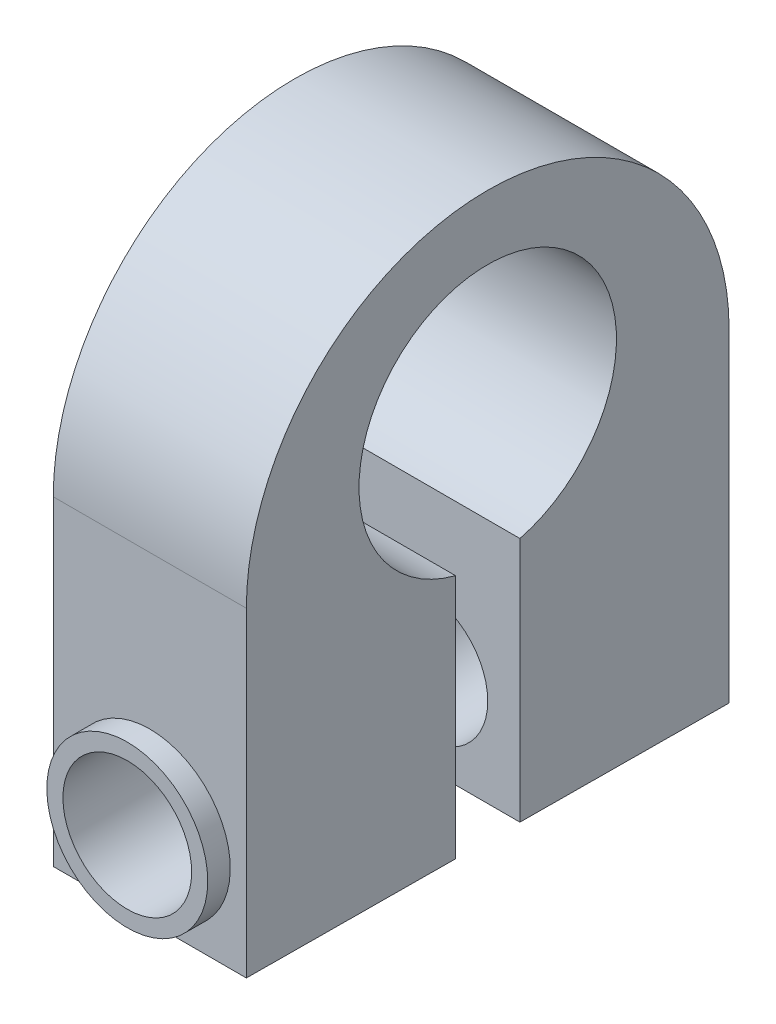
ISO-10303-21;
HEADER;
FILE_DESCRIPTION(('STEP AP214'),'2;1');
FILE_NAME('part.step','',(''),(''),'','','');
FILE_SCHEMA(('AUTOMOTIVE_DESIGN { 1 0 10303 214 1 1 1 1 }'));
ENDSEC;
DATA;
#1=APPLICATION_CONTEXT('core data for automotive mechanical design processes');
#2=APPLICATION_PROTOCOL_DEFINITION('international standard','automotive_design',2000,#1);
#3=PRODUCT_CONTEXT('',#1,'mechanical');
#4=PRODUCT('Part','Part','',(#3));
#5=PRODUCT_RELATED_PRODUCT_CATEGORY('part','',(#4));
#6=PRODUCT_DEFINITION_FORMATION('','',#4);
#7=PRODUCT_DEFINITION_CONTEXT('part definition',#1,'design');
#8=PRODUCT_DEFINITION('design','',#6,#7);
#9=PRODUCT_DEFINITION_SHAPE('','',#8);
#10=(LENGTH_UNIT() NAMED_UNIT(*) SI_UNIT(.MILLI.,.METRE.));
#11=(NAMED_UNIT(*) PLANE_ANGLE_UNIT() SI_UNIT($,.RADIAN.));
#12=(NAMED_UNIT(*) SI_UNIT($,.STERADIAN.) SOLID_ANGLE_UNIT());
#13=UNCERTAINTY_MEASURE_WITH_UNIT(LENGTH_MEASURE(1.E-05),#10,'distance_accuracy_value','');
#14=(GEOMETRIC_REPRESENTATION_CONTEXT(3) GLOBAL_UNCERTAINTY_ASSIGNED_CONTEXT((#13)) GLOBAL_UNIT_ASSIGNED_CONTEXT((#10,
#11,#12)) REPRESENTATION_CONTEXT('',''));
#15=CARTESIAN_POINT('',(0.,0.,0.));
#16=DIRECTION('',(0.,0.,1.));
#17=DIRECTION('',(1.,0.,0.));
#18=AXIS2_PLACEMENT_3D('',#15,#16,#17);
#19=CARTESIAN_POINT('',(0.,0.,81.0000000000001));
#20=DIRECTION('',(0.,0.,-1.));
#21=DIRECTION('',(-1.,0.,0.));
#22=AXIS2_PLACEMENT_3D('',#19,#20,#21);
#23=CYLINDRICAL_SURFACE('',#22,10.);
#24=CARTESIAN_POINT('',(0.,0.,0.));
#25=DIRECTION('',(0.,0.,1.));
#26=DIRECTION('',(1.,0.,0.));
#27=AXIS2_PLACEMENT_3D('',#24,#25,#26);
#28=CIRCLE('',#27,10.);
#29=CARTESIAN_POINT('',(10.,0.,0.));
#30=VERTEX_POINT('',#29);
#31=EDGE_CURVE('E156',#30,#30,#28,.T.);
#32=ORIENTED_EDGE('',*,*,#31,.F.);
#33=EDGE_LOOP('',(#32));
#34=FACE_BOUND('',#33,.T.);
#35=CARTESIAN_POINT('',(0.,0.,35.));
#36=DIRECTION('',(0.,0.,1.));
#37=DIRECTION('',(1.,0.,0.));
#38=AXIS2_PLACEMENT_3D('',#35,#36,#37);
#39=CIRCLE('',#38,10.);
#40=CARTESIAN_POINT('',(10.,0.,35.));
#41=VERTEX_POINT('',#40);
#42=EDGE_CURVE('E37',#41,#41,#39,.T.);
#43=ORIENTED_EDGE('',*,*,#42,.T.);
#44=EDGE_LOOP('',(#43));
#45=FACE_BOUND('',#44,.T.);
#46=ADVANCED_FACE('F33',(#34,#45),#23,.F.);
#47=CARTESIAN_POINT('',(0.,0.,81.0000000000001));
#48=DIRECTION('',(0.,0.,1.));
#49=DIRECTION('',(1.,0.,0.));
#50=AXIS2_PLACEMENT_3D('',#47,#48,#49);
#51=CIRCLE('',#50,10.);
#52=CARTESIAN_POINT('',(10.,0.,81.0000000000001));
#53=VERTEX_POINT('',#52);
#54=EDGE_CURVE('E153',#53,#53,#51,.T.);
#55=ORIENTED_EDGE('',*,*,#54,.T.);
#56=EDGE_LOOP('',(#55));
#57=FACE_BOUND('',#56,.T.);
#58=CARTESIAN_POINT('',(0.,0.,45.));
#59=DIRECTION('',(0.,0.,-1.));
#60=DIRECTION('',(-1.,0.,0.));
#61=AXIS2_PLACEMENT_3D('',#58,#59,#60);
#62=CIRCLE('',#61,10.);
#63=CARTESIAN_POINT('',(-10.,0.,45.));
#64=VERTEX_POINT('',#63);
#65=EDGE_CURVE('E222',#64,#64,#62,.T.);
#66=ORIENTED_EDGE('',*,*,#65,.T.);
#67=EDGE_LOOP('',(#66));
#68=FACE_BOUND('',#67,.T.);
#69=ADVANCED_FACE('F162',(#57,#68),#23,.F.);
#70=CARTESIAN_POINT('',(15.,0.,35.));
#71=DIRECTION('',(0.,0.,-1.));
#72=DIRECTION('',(-1.,0.,0.));
#73=AXIS2_PLACEMENT_3D('',#70,#71,#72);
#74=PLANE('',#73);
#75=DIRECTION('',(0.,-1.,0.));
#76=VECTOR('',#75,1.);
#77=CARTESIAN_POINT('',(-15.,0.,35.));
#78=LINE('',#77,#76);
#79=CARTESIAN_POINT('',(-15.,24.3850832689629,35.));
#80=VERTEX_POINT('',#79);
#81=CARTESIAN_POINT('',(-15.,-13.7833333333333,35.));
#82=VERTEX_POINT('',#81);
#83=EDGE_CURVE('E218',#80,#82,#78,.T.);
#84=ORIENTED_EDGE('',*,*,#83,.T.);
#85=DIRECTION('',(-1.,0.,0.));
#86=VECTOR('',#85,1.);
#87=CARTESIAN_POINT('',(15.,-13.7833333333333,35.));
#88=LINE('',#87,#86);
#89=CARTESIAN_POINT('',(15.,-13.7833333333333,35.));
#90=VERTEX_POINT('',#89);
#91=EDGE_CURVE('E227',#90,#82,#88,.T.);
#92=ORIENTED_EDGE('',*,*,#91,.F.);
#93=DIRECTION('',(0.,-1.,0.));
#94=VECTOR('',#93,1.);
#95=CARTESIAN_POINT('',(15.,0.,35.));
#96=LINE('',#95,#94);
#97=CARTESIAN_POINT('',(15.,24.3850832689629,35.));
#98=VERTEX_POINT('',#97);
#99=EDGE_CURVE('E136',#98,#90,#96,.T.);
#100=ORIENTED_EDGE('',*,*,#99,.F.);
#101=DIRECTION('',(-1.,0.,0.));
#102=VECTOR('',#101,1.);
#103=CARTESIAN_POINT('',(15.,24.3850832689629,35.));
#104=LINE('',#103,#102);
#105=EDGE_CURVE('E43',#98,#80,#104,.T.);
#106=ORIENTED_EDGE('',*,*,#105,.T.);
#107=EDGE_LOOP('',(#84,#92,#100,#106));
#108=FACE_BOUND('',#107,.T.);
#109=ORIENTED_EDGE('',*,*,#42,.F.);
#110=EDGE_LOOP('',(#109));
#111=FACE_BOUND('',#110,.T.);
#112=ADVANCED_FACE('F187',(#108,#111),#74,.F.);
#113=CARTESIAN_POINT('',(15.,0.,2.5));
#114=DIRECTION('',(0.,0.,-1.));
#115=DIRECTION('',(0.,1.,0.));
#116=AXIS2_PLACEMENT_3D('',#113,#114,#115);
#117=PLANE('',#116);
#118=DIRECTION('',(0.,-1.,0.));
#119=VECTOR('',#118,1.);
#120=CARTESIAN_POINT('',(-15.,0.,2.5));
#121=LINE('',#120,#119);
#122=CARTESIAN_POINT('',(-15.,36.25,2.5));
#123=VERTEX_POINT('',#122);
#124=CARTESIAN_POINT('',(-15.,-14.,2.5));
#125=VERTEX_POINT('',#124);
#126=EDGE_CURVE('E241',#123,#125,#121,.T.);
#127=ORIENTED_EDGE('',*,*,#126,.F.);
#128=DIRECTION('',(-1.,0.,0.));
#129=VECTOR('',#128,1.);
#130=CARTESIAN_POINT('',(15.,36.25,2.5));
#131=LINE('',#130,#129);
#132=CARTESIAN_POINT('',(15.,36.25,2.5));
#133=VERTEX_POINT('',#132);
#134=EDGE_CURVE('E231',#133,#123,#131,.T.);
#135=ORIENTED_EDGE('',*,*,#134,.F.);
#136=DIRECTION('',(0.,-1.,0.));
#137=VECTOR('',#136,1.);
#138=CARTESIAN_POINT('',(15.,0.,2.5));
#139=LINE('',#138,#137);
#140=CARTESIAN_POINT('',(15.,-14.,2.5));
#141=VERTEX_POINT('',#140);
#142=EDGE_CURVE('E135',#133,#141,#139,.T.);
#143=ORIENTED_EDGE('',*,*,#142,.T.);
#144=DIRECTION('',(-1.,0.,0.));
#145=VECTOR('',#144,1.);
#146=CARTESIAN_POINT('',(15.,-14.,2.5));
#147=LINE('',#146,#145);
#148=EDGE_CURVE('E229',#141,#125,#147,.T.);
#149=ORIENTED_EDGE('',*,*,#148,.T.);
#150=EDGE_LOOP('',(#127,#135,#143,#149));
#151=FACE_BOUND('',#150,.T.);
#152=CARTESIAN_POINT('',(0.,0.,2.5));
#153=DIRECTION('',(0.,0.,-1.));
#154=DIRECTION('',(0.,1.,0.));
#155=AXIS2_PLACEMENT_3D('',#152,#153,#154);
#156=CIRCLE('',#155,12.5);
#157=CARTESIAN_POINT('',(0.,12.5,2.5));
#158=VERTEX_POINT('',#157);
#159=EDGE_CURVE('E145',#158,#158,#156,.F.);
#160=ORIENTED_EDGE('',*,*,#159,.T.);
#161=EDGE_LOOP('',(#160));
#162=FACE_BOUND('',#161,.T.);
#163=ADVANCED_FACE('F205',(#151,#162),#117,.T.);
#164=CARTESIAN_POINT('',(15.,0.,77.5));
#165=DIRECTION('',(0.,0.,-1.));
#166=DIRECTION('',(0.,1.,0.));
#167=AXIS2_PLACEMENT_3D('',#164,#165,#166);
#168=PLANE('',#167);
#169=DIRECTION('',(0.,-1.,0.));
#170=VECTOR('',#169,1.);
#171=CARTESIAN_POINT('',(-15.,0.,77.5));
#172=LINE('',#171,#170);
#173=CARTESIAN_POINT('',(-15.,36.25,77.5));
#174=VERTEX_POINT('',#173);
#175=CARTESIAN_POINT('',(-15.,-13.5,77.5));
#176=VERTEX_POINT('',#175);
#177=EDGE_CURVE('E122',#174,#176,#172,.T.);
#178=ORIENTED_EDGE('',*,*,#177,.T.);
#179=DIRECTION('',(-1.,0.,0.));
#180=VECTOR('',#179,1.);
#181=CARTESIAN_POINT('',(15.,-13.5,77.5));
#182=LINE('',#181,#180);
#183=CARTESIAN_POINT('',(15.,-13.5,77.5));
#184=VERTEX_POINT('',#183);
#185=EDGE_CURVE('E118',#184,#176,#182,.T.);
#186=ORIENTED_EDGE('',*,*,#185,.F.);
#187=DIRECTION('',(0.,-1.,0.));
#188=VECTOR('',#187,1.);
#189=CARTESIAN_POINT('',(15.,0.,77.5));
#190=LINE('',#189,#188);
#191=CARTESIAN_POINT('',(15.,36.25,77.5));
#192=VERTEX_POINT('',#191);
#193=EDGE_CURVE('E105',#192,#184,#190,.T.);
#194=ORIENTED_EDGE('',*,*,#193,.F.);
#195=DIRECTION('',(-1.,0.,0.));
#196=VECTOR('',#195,1.);
#197=CARTESIAN_POINT('',(15.,36.25,77.5));
#198=LINE('',#197,#196);
#199=EDGE_CURVE('E126',#192,#174,#198,.T.);
#200=ORIENTED_EDGE('',*,*,#199,.T.);
#201=EDGE_LOOP('',(#178,#186,#194,#200));
#202=FACE_BOUND('',#201,.T.);
#203=CARTESIAN_POINT('',(0.,0.,77.5));
#204=DIRECTION('',(0.,0.,-1.));
#205=DIRECTION('',(0.,1.,0.));
#206=AXIS2_PLACEMENT_3D('',#203,#204,#205);
#207=CIRCLE('',#206,12.5);
#208=CARTESIAN_POINT('',(0.,12.5,77.5));
#209=VERTEX_POINT('',#208);
#210=EDGE_CURVE('E11',#209,#209,#207,.F.);
#211=ORIENTED_EDGE('',*,*,#210,.F.);
#212=EDGE_LOOP('',(#211));
#213=FACE_BOUND('',#212,.T.);
#214=ADVANCED_FACE('F119',(#202,#213),#168,.F.);
#215=CARTESIAN_POINT('',(15.,0.,45.));
#216=DIRECTION('',(0.,0.,1.));
#217=DIRECTION('',(1.,0.,0.));
#218=AXIS2_PLACEMENT_3D('',#215,#216,#217);
#219=PLANE('',#218);
#220=DIRECTION('',(0.,1.,0.));
#221=VECTOR('',#220,1.);
#222=CARTESIAN_POINT('',(-15.,0.,45.));
#223=LINE('',#222,#221);
#224=CARTESIAN_POINT('',(-15.,-13.7166666666667,45.));
#225=VERTEX_POINT('',#224);
#226=CARTESIAN_POINT('',(-15.,24.3850832689629,45.));
#227=VERTEX_POINT('',#226);
#228=EDGE_CURVE('E142',#225,#227,#223,.T.);
#229=ORIENTED_EDGE('',*,*,#228,.T.);
#230=DIRECTION('',(-1.,0.,0.));
#231=VECTOR('',#230,1.);
#232=CARTESIAN_POINT('',(15.,24.3850832689629,45.));
#233=LINE('',#232,#231);
#234=CARTESIAN_POINT('',(15.,24.3850832689629,45.));
#235=VERTEX_POINT('',#234);
#236=EDGE_CURVE('E87',#235,#227,#233,.T.);
#237=ORIENTED_EDGE('',*,*,#236,.F.);
#238=DIRECTION('',(0.,1.,0.));
#239=VECTOR('',#238,1.);
#240=CARTESIAN_POINT('',(15.,0.,45.));
#241=LINE('',#240,#239);
#242=CARTESIAN_POINT('',(15.,-13.7166666666667,45.));
#243=VERTEX_POINT('',#242);
#244=EDGE_CURVE('E52',#243,#235,#241,.T.);
#245=ORIENTED_EDGE('',*,*,#244,.F.);
#246=DIRECTION('',(-1.,0.,0.));
#247=VECTOR('',#246,1.);
#248=CARTESIAN_POINT('',(15.,-13.7166666666667,45.));
#249=LINE('',#248,#247);
#250=EDGE_CURVE('E80',#243,#225,#249,.T.);
#251=ORIENTED_EDGE('',*,*,#250,.T.);
#252=EDGE_LOOP('',(#229,#237,#245,#251));
#253=FACE_BOUND('',#252,.T.);
#254=ORIENTED_EDGE('',*,*,#65,.F.);
#255=EDGE_LOOP('',(#254));
#256=FACE_BOUND('',#255,.T.);
#257=ADVANCED_FACE('F196',(#253,#256),#219,.F.);
#258=CARTESIAN_POINT('',(15.,43.75,40.));
#259=DIRECTION('',(-1.,0.,0.));
#260=DIRECTION('',(0.,0.,1.));
#261=AXIS2_PLACEMENT_3D('',#258,#259,#260);
#262=CYLINDRICAL_SURFACE('',#261,20.);
#263=CARTESIAN_POINT('',(-15.,43.75,40.));
#264=DIRECTION('',(1.,0.,0.));
#265=DIRECTION('',(0.,0.,-1.));
#266=AXIS2_PLACEMENT_3D('',#263,#264,#265);
#267=CIRCLE('',#266,20.);
#268=EDGE_CURVE('E147',#80,#227,#267,.T.);
#269=ORIENTED_EDGE('',*,*,#268,.F.);
#270=ORIENTED_EDGE('',*,*,#105,.F.);
#271=CARTESIAN_POINT('',(15.,43.75,40.));
#272=DIRECTION('',(1.,0.,0.));
#273=DIRECTION('',(0.,0.,-1.));
#274=AXIS2_PLACEMENT_3D('',#271,#272,#273);
#275=CIRCLE('',#274,20.);
#276=EDGE_CURVE('E140',#98,#235,#275,.T.);
#277=ORIENTED_EDGE('',*,*,#276,.T.);
#278=ORIENTED_EDGE('',*,*,#236,.T.);
#279=EDGE_LOOP('',(#269,#270,#277,#278));
#280=FACE_BOUND('',#279,.T.);
#281=ADVANCED_FACE('F35',(#280),#262,.F.);
#282=CARTESIAN_POINT('',(15.,-14.0160437313897,0.0934402915425982));
#283=DIRECTION('',(0.,-0.999977778518491,0.00666651852345661));
#284=DIRECTION('',(0.,-0.00666651852345661,-0.999977778518491));
#285=AXIS2_PLACEMENT_3D('',#282,#283,#284);
#286=PLANE('',#285);
#287=DIRECTION('',(0.,0.00666651852345661,0.999977778518491));
#288=VECTOR('',#287,1.);
#289=CARTESIAN_POINT('',(-15.,-14.0160437313897,0.0934402915425982));
#290=LINE('',#289,#288);
#291=EDGE_CURVE('E244',#125,#82,#290,.T.);
#292=ORIENTED_EDGE('',*,*,#291,.F.);
#293=ORIENTED_EDGE('',*,*,#148,.F.);
#294=DIRECTION('',(0.,0.00666651852345661,0.999977778518491));
#295=VECTOR('',#294,1.);
#296=CARTESIAN_POINT('',(15.,-14.0160437313897,0.0934402915425982));
#297=LINE('',#296,#295);
#298=EDGE_CURVE('E130',#141,#90,#297,.T.);
#299=ORIENTED_EDGE('',*,*,#298,.T.);
#300=ORIENTED_EDGE('',*,*,#91,.T.);
#301=EDGE_LOOP('',(#292,#293,#299,#300));
#302=FACE_BOUND('',#301,.T.);
#303=ADVANCED_FACE('F202',(#302),#286,.T.);
#304=CARTESIAN_POINT('',(15.,36.25,40.));
#305=DIRECTION('',(-1.,0.,0.));
#306=DIRECTION('',(0.,0.,1.));
#307=AXIS2_PLACEMENT_3D('',#304,#305,#306);
#308=CYLINDRICAL_SURFACE('',#307,37.5);
#309=CARTESIAN_POINT('',(-15.,36.25,40.));
#310=DIRECTION('',(1.,0.,0.));
#311=DIRECTION('',(0.,0.,-1.));
#312=AXIS2_PLACEMENT_3D('',#309,#310,#311);
#313=CIRCLE('',#312,37.5);
#314=EDGE_CURVE('E239',#123,#174,#313,.T.);
#315=ORIENTED_EDGE('',*,*,#314,.T.);
#316=ORIENTED_EDGE('',*,*,#199,.F.);
#317=CARTESIAN_POINT('',(15.,36.25,40.));
#318=DIRECTION('',(1.,0.,0.));
#319=DIRECTION('',(0.,0.,-1.));
#320=AXIS2_PLACEMENT_3D('',#317,#318,#319);
#321=CIRCLE('',#320,37.5);
#322=EDGE_CURVE('E112',#133,#192,#321,.T.);
#323=ORIENTED_EDGE('',*,*,#322,.F.);
#324=ORIENTED_EDGE('',*,*,#134,.T.);
#325=EDGE_LOOP('',(#315,#316,#323,#324));
#326=FACE_BOUND('',#325,.T.);
#327=ADVANCED_FACE('F201',(#326),#308,.T.);
#328=EDGE_CURVE('E237',#225,#176,#290,.T.);
#329=ORIENTED_EDGE('',*,*,#328,.F.);
#330=ORIENTED_EDGE('',*,*,#250,.F.);
#331=EDGE_CURVE('E109',#243,#184,#297,.T.);
#332=ORIENTED_EDGE('',*,*,#331,.T.);
#333=ORIENTED_EDGE('',*,*,#185,.T.);
#334=EDGE_LOOP('',(#329,#330,#332,#333));
#335=FACE_BOUND('',#334,.T.);
#336=ADVANCED_FACE('F128',(#335),#286,.T.);
#337=CARTESIAN_POINT('',(15.,0.,0.));
#338=DIRECTION('',(1.,0.,0.));
#339=DIRECTION('',(0.,0.,-1.));
#340=AXIS2_PLACEMENT_3D('',#337,#338,#339);
#341=PLANE('',#340);
#342=ORIENTED_EDGE('',*,*,#276,.F.);
#343=ORIENTED_EDGE('',*,*,#99,.T.);
#344=ORIENTED_EDGE('',*,*,#298,.F.);
#345=ORIENTED_EDGE('',*,*,#142,.F.);
#346=ORIENTED_EDGE('',*,*,#322,.T.);
#347=ORIENTED_EDGE('',*,*,#193,.T.);
#348=ORIENTED_EDGE('',*,*,#331,.F.);
#349=ORIENTED_EDGE('',*,*,#244,.T.);
#350=EDGE_LOOP('',(#342,#343,#344,#345,#346,#347,#348,#349));
#351=FACE_BOUND('',#350,.T.);
#352=ADVANCED_FACE('F107',(#351),#341,.T.);
#353=CARTESIAN_POINT('',(-15.,0.,0.));
#354=DIRECTION('',(1.,0.,0.));
#355=DIRECTION('',(0.,0.,-1.));
#356=AXIS2_PLACEMENT_3D('',#353,#354,#355);
#357=PLANE('',#356);
#358=ORIENTED_EDGE('',*,*,#268,.T.);
#359=ORIENTED_EDGE('',*,*,#228,.F.);
#360=ORIENTED_EDGE('',*,*,#328,.T.);
#361=ORIENTED_EDGE('',*,*,#177,.F.);
#362=ORIENTED_EDGE('',*,*,#314,.F.);
#363=ORIENTED_EDGE('',*,*,#126,.T.);
#364=ORIENTED_EDGE('',*,*,#291,.T.);
#365=ORIENTED_EDGE('',*,*,#83,.F.);
#366=EDGE_LOOP('',(#358,#359,#360,#361,#362,#363,#364,#365));
#367=FACE_BOUND('',#366,.T.);
#368=ADVANCED_FACE('F178',(#367),#357,.F.);
#369=CARTESIAN_POINT('',(0.,0.,81.0000000000001));
#370=DIRECTION('',(0.,0.,-1.));
#371=DIRECTION('',(-1.,0.,0.));
#372=AXIS2_PLACEMENT_3D('',#369,#370,#371);
#373=CYLINDRICAL_SURFACE('',#372,12.5);
#374=CARTESIAN_POINT('',(0.,0.,81.0000000000001));
#375=DIRECTION('',(0.,0.,1.));
#376=DIRECTION('',(1.,0.,0.));
#377=AXIS2_PLACEMENT_3D('',#374,#375,#376);
#378=CIRCLE('',#377,12.5);
#379=CARTESIAN_POINT('',(12.5,0.,81.0000000000001));
#380=VERTEX_POINT('',#379);
#381=EDGE_CURVE('E148',#380,#380,#378,.T.);
#382=ORIENTED_EDGE('',*,*,#381,.F.);
#383=EDGE_LOOP('',(#382));
#384=FACE_BOUND('',#383,.T.);
#385=ORIENTED_EDGE('',*,*,#210,.T.);
#386=EDGE_LOOP('',(#385));
#387=FACE_BOUND('',#386,.T.);
#388=ADVANCED_FACE('F168',(#384,#387),#373,.T.);
#389=CARTESIAN_POINT('',(0.,0.,81.0000000000001));
#390=DIRECTION('',(0.,0.,1.));
#391=DIRECTION('',(1.,0.,0.));
#392=AXIS2_PLACEMENT_3D('',#389,#390,#391);
#393=PLANE('',#392);
#394=ORIENTED_EDGE('',*,*,#381,.T.);
#395=EDGE_LOOP('',(#394));
#396=FACE_BOUND('',#395,.T.);
#397=ORIENTED_EDGE('',*,*,#54,.F.);
#398=EDGE_LOOP('',(#397));
#399=FACE_BOUND('',#398,.T.);
#400=ADVANCED_FACE('F165',(#396,#399),#393,.T.);
#401=ORIENTED_EDGE('',*,*,#159,.F.);
#402=EDGE_LOOP('',(#401));
#403=FACE_BOUND('',#402,.T.);
#404=CARTESIAN_POINT('',(0.,0.,0.));
#405=DIRECTION('',(0.,0.,1.));
#406=DIRECTION('',(1.,0.,0.));
#407=AXIS2_PLACEMENT_3D('',#404,#405,#406);
#408=CIRCLE('',#407,12.5);
#409=CARTESIAN_POINT('',(12.5,0.,0.));
#410=VERTEX_POINT('',#409);
#411=EDGE_CURVE('E150',#410,#410,#408,.T.);
#412=ORIENTED_EDGE('',*,*,#411,.T.);
#413=EDGE_LOOP('',(#412));
#414=FACE_BOUND('',#413,.T.);
#415=ADVANCED_FACE('F167',(#403,#414),#373,.T.);
#416=CARTESIAN_POINT('',(0.,0.,0.));
#417=DIRECTION('',(0.,0.,1.));
#418=DIRECTION('',(1.,0.,0.));
#419=AXIS2_PLACEMENT_3D('',#416,#417,#418);
#420=PLANE('',#419);
#421=ORIENTED_EDGE('',*,*,#411,.F.);
#422=EDGE_LOOP('',(#421));
#423=FACE_BOUND('',#422,.T.);
#424=ORIENTED_EDGE('',*,*,#31,.T.);
#425=EDGE_LOOP('',(#424));
#426=FACE_BOUND('',#425,.T.);
#427=ADVANCED_FACE('F175',(#423,#426),#420,.F.);
#428=CLOSED_SHELL('',(#46,#69,#112,#163,#214,#257,#281,#303,#327,#336,#352,#368,#388,#400,#415,#427));
#429=MANIFOLD_SOLID_BREP('B2',#428);
#430=ADVANCED_BREP_SHAPE_REPRESENTATION('',(#18,#429),#14);
#431=SHAPE_DEFINITION_REPRESENTATION(#9,#430);
ENDSEC;
END-ISO-10303-21;
